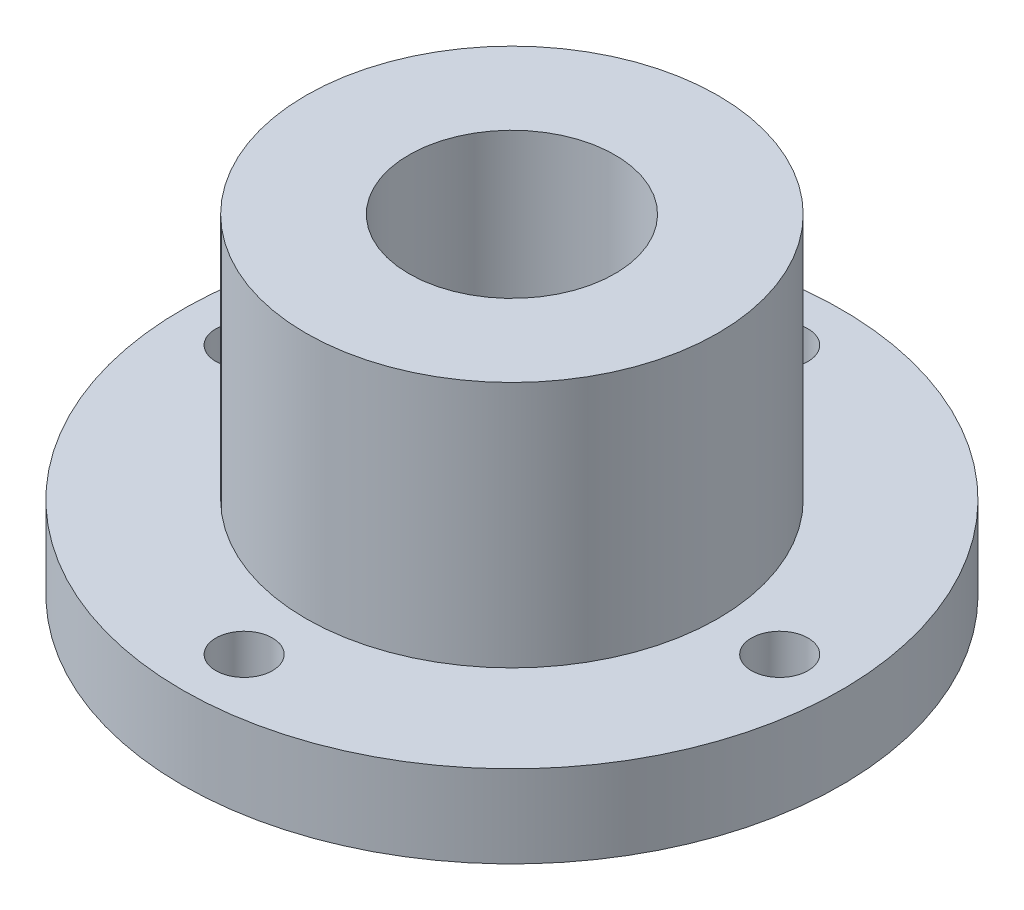
ISO-10303-21;
HEADER;
FILE_DESCRIPTION(('STEP AP214'),'2;1');
FILE_NAME('part.step','',(''),(''),'','','');
FILE_SCHEMA(('AUTOMOTIVE_DESIGN { 1 0 10303 214 1 1 1 1 }'));
ENDSEC;
DATA;
#1=APPLICATION_CONTEXT('core data for automotive mechanical design processes');
#2=APPLICATION_PROTOCOL_DEFINITION('international standard','automotive_design',2000,#1);
#3=PRODUCT_CONTEXT('',#1,'mechanical');
#4=PRODUCT('Part','Part','',(#3));
#5=PRODUCT_RELATED_PRODUCT_CATEGORY('part','',(#4));
#6=PRODUCT_DEFINITION_FORMATION('','',#4);
#7=PRODUCT_DEFINITION_CONTEXT('part definition',#1,'design');
#8=PRODUCT_DEFINITION('design','',#6,#7);
#9=PRODUCT_DEFINITION_SHAPE('','',#8);
#10=(LENGTH_UNIT() NAMED_UNIT(*) SI_UNIT(.MILLI.,.METRE.));
#11=(NAMED_UNIT(*) PLANE_ANGLE_UNIT() SI_UNIT($,.RADIAN.));
#12=(NAMED_UNIT(*) SI_UNIT($,.STERADIAN.) SOLID_ANGLE_UNIT());
#13=UNCERTAINTY_MEASURE_WITH_UNIT(LENGTH_MEASURE(1.E-05),#10,'distance_accuracy_value','');
#14=(GEOMETRIC_REPRESENTATION_CONTEXT(3) GLOBAL_UNCERTAINTY_ASSIGNED_CONTEXT((#13)) GLOBAL_UNIT_ASSIGNED_CONTEXT((#10,
#11,#12)) REPRESENTATION_CONTEXT('',''));
#15=CARTESIAN_POINT('',(0.,0.,0.));
#16=DIRECTION('',(0.,0.,1.));
#17=DIRECTION('',(1.,0.,0.));
#18=AXIS2_PLACEMENT_3D('',#15,#16,#17);
#19=CARTESIAN_POINT('',(0.,79.3526785714284,0.));
#20=DIRECTION('',(0.,1.,0.));
#21=DIRECTION('',(0.,0.,1.));
#22=AXIS2_PLACEMENT_3D('',#19,#20,#21);
#23=CYLINDRICAL_SURFACE('',#22,9.99999999999999);
#24=CARTESIAN_POINT('',(0.,32.,0.));
#25=DIRECTION('',(0.,1.,0.));
#26=DIRECTION('',(0.,0.,1.));
#27=AXIS2_PLACEMENT_3D('',#24,#25,#26);
#28=CIRCLE('',#27,9.99999999999999);
#29=CARTESIAN_POINT('',(0.,32.,9.99999999999999));
#30=VERTEX_POINT('',#29);
#31=EDGE_CURVE('E55',#30,#30,#28,.T.);
#32=ORIENTED_EDGE('',*,*,#31,.T.);
#33=EDGE_LOOP('',(#32));
#34=FACE_BOUND('',#33,.T.);
#35=CARTESIAN_POINT('',(0.,0.,0.));
#36=DIRECTION('',(0.,1.,0.));
#37=DIRECTION('',(0.,0.,1.));
#38=AXIS2_PLACEMENT_3D('',#35,#36,#37);
#39=CIRCLE('',#38,9.99999999999999);
#40=CARTESIAN_POINT('',(0.,0.,9.99999999999999));
#41=VERTEX_POINT('',#40);
#42=EDGE_CURVE('E10',#41,#41,#39,.T.);
#43=ORIENTED_EDGE('',*,*,#42,.F.);
#44=EDGE_LOOP('',(#43));
#45=FACE_BOUND('',#44,.T.);
#46=ADVANCED_FACE('F33',(#34,#45),#23,.F.);
#47=CARTESIAN_POINT('',(-9.99999999999999,0.,0.));
#48=DIRECTION('',(0.,-1.,0.));
#49=DIRECTION('',(0.,0.,-1.));
#50=AXIS2_PLACEMENT_3D('',#47,#48,#49);
#51=PLANE('',#50);
#52=CARTESIAN_POINT('',(0.,0.,-26.));
#53=DIRECTION('',(0.,-1.,0.));
#54=DIRECTION('',(0.,0.,-1.));
#55=AXIS2_PLACEMENT_3D('',#52,#53,#54);
#56=CIRCLE('',#55,2.75);
#57=CARTESIAN_POINT('',(0.,0.,-28.75));
#58=VERTEX_POINT('',#57);
#59=EDGE_CURVE('E58',#58,#58,#56,.T.);
#60=ORIENTED_EDGE('',*,*,#59,.F.);
#61=EDGE_LOOP('',(#60));
#62=FACE_BOUND('',#61,.T.);
#63=CARTESIAN_POINT('',(26.,0.,0.));
#64=DIRECTION('',(0.,-1.,0.));
#65=DIRECTION('',(0.,0.,-1.));
#66=AXIS2_PLACEMENT_3D('',#63,#64,#65);
#67=CIRCLE('',#66,2.75);
#68=CARTESIAN_POINT('',(26.,0.,-2.75));
#69=VERTEX_POINT('',#68);
#70=EDGE_CURVE('E61',#69,#69,#67,.T.);
#71=ORIENTED_EDGE('',*,*,#70,.F.);
#72=EDGE_LOOP('',(#71));
#73=FACE_BOUND('',#72,.T.);
#74=CARTESIAN_POINT('',(0.,0.,26.));
#75=DIRECTION('',(0.,-1.,0.));
#76=DIRECTION('',(0.,0.,-1.));
#77=AXIS2_PLACEMENT_3D('',#74,#75,#76);
#78=CIRCLE('',#77,2.75);
#79=CARTESIAN_POINT('',(0.,0.,23.25));
#80=VERTEX_POINT('',#79);
#81=EDGE_CURVE('E64',#80,#80,#78,.T.);
#82=ORIENTED_EDGE('',*,*,#81,.F.);
#83=EDGE_LOOP('',(#82));
#84=FACE_BOUND('',#83,.T.);
#85=CARTESIAN_POINT('',(-26.,0.,0.));
#86=DIRECTION('',(0.,-1.,0.));
#87=DIRECTION('',(0.,0.,-1.));
#88=AXIS2_PLACEMENT_3D('',#85,#86,#87);
#89=CIRCLE('',#88,2.75);
#90=CARTESIAN_POINT('',(-26.,0.,-2.74999999999999));
#91=VERTEX_POINT('',#90);
#92=EDGE_CURVE('E67',#91,#91,#89,.T.);
#93=ORIENTED_EDGE('',*,*,#92,.F.);
#94=EDGE_LOOP('',(#93));
#95=FACE_BOUND('',#94,.T.);
#96=ORIENTED_EDGE('',*,*,#42,.T.);
#97=EDGE_LOOP('',(#96));
#98=FACE_BOUND('',#97,.T.);
#99=CARTESIAN_POINT('',(0.,0.,0.));
#100=DIRECTION('',(0.,1.,0.));
#101=DIRECTION('',(0.,0.,1.));
#102=AXIS2_PLACEMENT_3D('',#99,#100,#101);
#103=CIRCLE('',#102,32.);
#104=CARTESIAN_POINT('',(0.,0.,32.));
#105=VERTEX_POINT('',#104);
#106=EDGE_CURVE('E39',#105,#105,#103,.T.);
#107=ORIENTED_EDGE('',*,*,#106,.F.);
#108=EDGE_LOOP('',(#107));
#109=FACE_BOUND('',#108,.T.);
#110=ADVANCED_FACE('F115',(#62,#73,#84,#95,#98,#109),#51,.T.);
#111=CARTESIAN_POINT('',(0.,79.3526785714284,0.));
#112=DIRECTION('',(0.,1.,0.));
#113=DIRECTION('',(0.,0.,1.));
#114=AXIS2_PLACEMENT_3D('',#111,#112,#113);
#115=CYLINDRICAL_SURFACE('',#114,32.);
#116=ORIENTED_EDGE('',*,*,#106,.T.);
#117=EDGE_LOOP('',(#116));
#118=FACE_BOUND('',#117,.T.);
#119=CARTESIAN_POINT('',(0.,7.99999999999999,0.));
#120=DIRECTION('',(0.,1.,0.));
#121=DIRECTION('',(0.,0.,1.));
#122=AXIS2_PLACEMENT_3D('',#119,#120,#121);
#123=CIRCLE('',#122,32.);
#124=CARTESIAN_POINT('',(0.,7.99999999999999,32.));
#125=VERTEX_POINT('',#124);
#126=EDGE_CURVE('E43',#125,#125,#123,.T.);
#127=ORIENTED_EDGE('',*,*,#126,.F.);
#128=EDGE_LOOP('',(#127));
#129=FACE_BOUND('',#128,.T.);
#130=ADVANCED_FACE('F89',(#118,#129),#115,.T.);
#131=CARTESIAN_POINT('',(-32.,8.,0.));
#132=DIRECTION('',(0.,1.,0.));
#133=DIRECTION('',(0.,0.,1.));
#134=AXIS2_PLACEMENT_3D('',#131,#132,#133);
#135=PLANE('',#134);
#136=CARTESIAN_POINT('',(0.,8.,-26.));
#137=DIRECTION('',(0.,1.,0.));
#138=DIRECTION('',(0.,0.,1.));
#139=AXIS2_PLACEMENT_3D('',#136,#137,#138);
#140=CIRCLE('',#139,2.75);
#141=CARTESIAN_POINT('',(0.,8.,-23.25));
#142=VERTEX_POINT('',#141);
#143=EDGE_CURVE('E70',#142,#142,#140,.T.);
#144=ORIENTED_EDGE('',*,*,#143,.F.);
#145=EDGE_LOOP('',(#144));
#146=FACE_BOUND('',#145,.T.);
#147=CARTESIAN_POINT('',(26.,8.,0.));
#148=DIRECTION('',(0.,1.,0.));
#149=DIRECTION('',(0.,0.,1.));
#150=AXIS2_PLACEMENT_3D('',#147,#148,#149);
#151=CIRCLE('',#150,2.75);
#152=CARTESIAN_POINT('',(26.,8.,2.75));
#153=VERTEX_POINT('',#152);
#154=EDGE_CURVE('E77',#153,#153,#151,.T.);
#155=ORIENTED_EDGE('',*,*,#154,.F.);
#156=EDGE_LOOP('',(#155));
#157=FACE_BOUND('',#156,.T.);
#158=CARTESIAN_POINT('',(0.,8.,26.));
#159=DIRECTION('',(0.,1.,0.));
#160=DIRECTION('',(0.,0.,1.));
#161=AXIS2_PLACEMENT_3D('',#158,#159,#160);
#162=CIRCLE('',#161,2.75);
#163=CARTESIAN_POINT('',(0.,8.,28.75));
#164=VERTEX_POINT('',#163);
#165=EDGE_CURVE('E74',#164,#164,#162,.T.);
#166=ORIENTED_EDGE('',*,*,#165,.F.);
#167=EDGE_LOOP('',(#166));
#168=FACE_BOUND('',#167,.T.);
#169=CARTESIAN_POINT('',(-26.,8.,0.));
#170=DIRECTION('',(0.,1.,0.));
#171=DIRECTION('',(0.,0.,1.));
#172=AXIS2_PLACEMENT_3D('',#169,#170,#171);
#173=CIRCLE('',#172,2.75);
#174=CARTESIAN_POINT('',(-26.,8.,2.75));
#175=VERTEX_POINT('',#174);
#176=EDGE_CURVE('E71',#175,#175,#173,.T.);
#177=ORIENTED_EDGE('',*,*,#176,.F.);
#178=EDGE_LOOP('',(#177));
#179=FACE_BOUND('',#178,.T.);
#180=ORIENTED_EDGE('',*,*,#126,.T.);
#181=EDGE_LOOP('',(#180));
#182=FACE_BOUND('',#181,.T.);
#183=CARTESIAN_POINT('',(0.,7.99999999999999,0.));
#184=DIRECTION('',(0.,1.,0.));
#185=DIRECTION('',(0.,0.,1.));
#186=AXIS2_PLACEMENT_3D('',#183,#184,#185);
#187=CIRCLE('',#186,20.);
#188=CARTESIAN_POINT('',(0.,7.99999999999999,20.));
#189=VERTEX_POINT('',#188);
#190=EDGE_CURVE('E47',#189,#189,#187,.T.);
#191=ORIENTED_EDGE('',*,*,#190,.F.);
#192=EDGE_LOOP('',(#191));
#193=FACE_BOUND('',#192,.T.);
#194=ADVANCED_FACE('F85',(#146,#157,#168,#179,#182,#193),#135,.T.);
#195=CARTESIAN_POINT('',(0.,79.3526785714284,0.));
#196=DIRECTION('',(0.,1.,0.));
#197=DIRECTION('',(0.,0.,1.));
#198=AXIS2_PLACEMENT_3D('',#195,#196,#197);
#199=CYLINDRICAL_SURFACE('',#198,20.);
#200=ORIENTED_EDGE('',*,*,#190,.T.);
#201=EDGE_LOOP('',(#200));
#202=FACE_BOUND('',#201,.T.);
#203=CARTESIAN_POINT('',(0.,32.,0.));
#204=DIRECTION('',(0.,1.,0.));
#205=DIRECTION('',(0.,0.,1.));
#206=AXIS2_PLACEMENT_3D('',#203,#204,#205);
#207=CIRCLE('',#206,20.);
#208=CARTESIAN_POINT('',(0.,32.,20.));
#209=VERTEX_POINT('',#208);
#210=EDGE_CURVE('E52',#209,#209,#207,.T.);
#211=ORIENTED_EDGE('',*,*,#210,.F.);
#212=EDGE_LOOP('',(#211));
#213=FACE_BOUND('',#212,.T.);
#214=ADVANCED_FACE('F88',(#202,#213),#199,.T.);
#215=CARTESIAN_POINT('',(-20.,32.,0.));
#216=DIRECTION('',(0.,1.,0.));
#217=DIRECTION('',(0.,0.,1.));
#218=AXIS2_PLACEMENT_3D('',#215,#216,#217);
#219=PLANE('',#218);
#220=ORIENTED_EDGE('',*,*,#210,.T.);
#221=EDGE_LOOP('',(#220));
#222=FACE_BOUND('',#221,.T.);
#223=ORIENTED_EDGE('',*,*,#31,.F.);
#224=EDGE_LOOP('',(#223));
#225=FACE_BOUND('',#224,.T.);
#226=ADVANCED_FACE('F103',(#222,#225),#219,.T.);
#227=CARTESIAN_POINT('',(-26.,-2.,0.));
#228=DIRECTION('',(0.,1.,0.));
#229=DIRECTION('',(0.,0.,1.));
#230=AXIS2_PLACEMENT_3D('',#227,#228,#229);
#231=CYLINDRICAL_SURFACE('',#230,2.75);
#232=ORIENTED_EDGE('',*,*,#92,.T.);
#233=EDGE_LOOP('',(#232));
#234=FACE_BOUND('',#233,.T.);
#235=ORIENTED_EDGE('',*,*,#176,.T.);
#236=EDGE_LOOP('',(#235));
#237=FACE_BOUND('',#236,.T.);
#238=ADVANCED_FACE('F109',(#234,#237),#231,.F.);
#239=CARTESIAN_POINT('',(0.,-2.,26.));
#240=DIRECTION('',(0.,1.,0.));
#241=DIRECTION('',(0.,0.,1.));
#242=AXIS2_PLACEMENT_3D('',#239,#240,#241);
#243=CYLINDRICAL_SURFACE('',#242,2.75);
#244=ORIENTED_EDGE('',*,*,#81,.T.);
#245=EDGE_LOOP('',(#244));
#246=FACE_BOUND('',#245,.T.);
#247=ORIENTED_EDGE('',*,*,#165,.T.);
#248=EDGE_LOOP('',(#247));
#249=FACE_BOUND('',#248,.T.);
#250=ADVANCED_FACE('F129',(#246,#249),#243,.F.);
#251=CARTESIAN_POINT('',(26.,-2.,0.));
#252=DIRECTION('',(0.,1.,0.));
#253=DIRECTION('',(0.,0.,1.));
#254=AXIS2_PLACEMENT_3D('',#251,#252,#253);
#255=CYLINDRICAL_SURFACE('',#254,2.75);
#256=ORIENTED_EDGE('',*,*,#70,.T.);
#257=EDGE_LOOP('',(#256));
#258=FACE_BOUND('',#257,.T.);
#259=ORIENTED_EDGE('',*,*,#154,.T.);
#260=EDGE_LOOP('',(#259));
#261=FACE_BOUND('',#260,.T.);
#262=ADVANCED_FACE('F133',(#258,#261),#255,.F.);
#263=CARTESIAN_POINT('',(0.,-2.,-26.));
#264=DIRECTION('',(0.,1.,0.));
#265=DIRECTION('',(0.,0.,1.));
#266=AXIS2_PLACEMENT_3D('',#263,#264,#265);
#267=CYLINDRICAL_SURFACE('',#266,2.75);
#268=ORIENTED_EDGE('',*,*,#59,.T.);
#269=EDGE_LOOP('',(#268));
#270=FACE_BOUND('',#269,.T.);
#271=ORIENTED_EDGE('',*,*,#143,.T.);
#272=EDGE_LOOP('',(#271));
#273=FACE_BOUND('',#272,.T.);
#274=ADVANCED_FACE('F83',(#270,#273),#267,.F.);
#275=CLOSED_SHELL('',(#46,#110,#130,#194,#214,#226,#238,#250,#262,#274));
#276=MANIFOLD_SOLID_BREP('B2',#275);
#277=ADVANCED_BREP_SHAPE_REPRESENTATION('',(#18,#276),#14);
#278=SHAPE_DEFINITION_REPRESENTATION(#9,#277);
ENDSEC;
END-ISO-10303-21;
